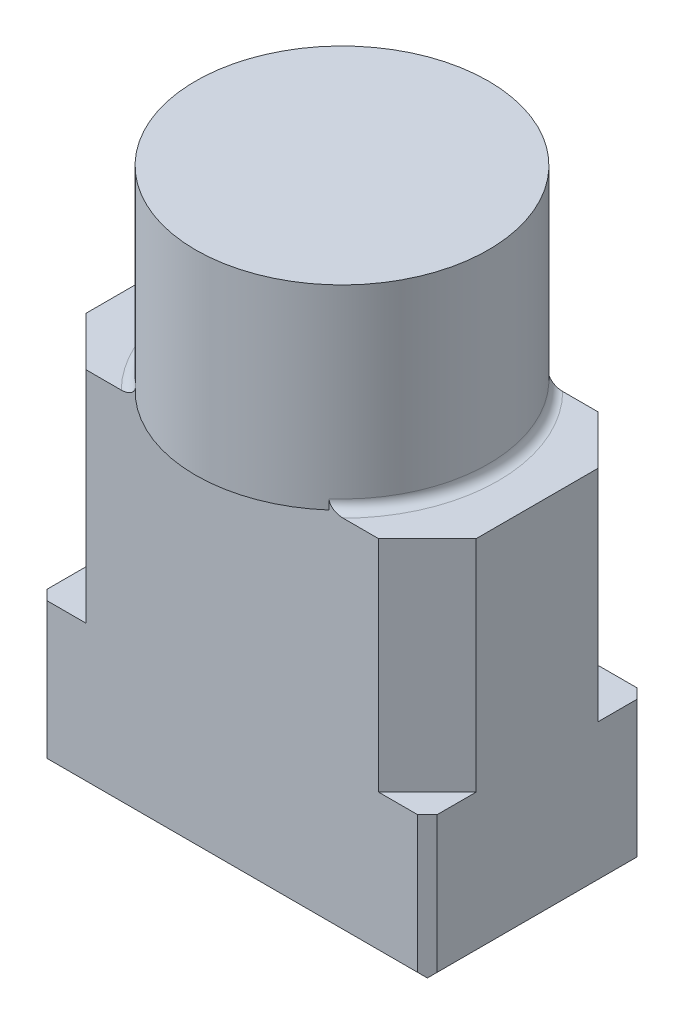
ISO-10303-21;
HEADER;
FILE_DESCRIPTION(('STEP AP214'),'2;1');
FILE_NAME('part.step','',(''),(''),'','','');
FILE_SCHEMA(('AUTOMOTIVE_DESIGN { 1 0 10303 214 1 1 1 1 }'));
ENDSEC;
DATA;
#1=APPLICATION_CONTEXT('core data for automotive mechanical design processes');
#2=APPLICATION_PROTOCOL_DEFINITION('international standard','automotive_design',2000,#1);
#3=PRODUCT_CONTEXT('',#1,'mechanical');
#4=PRODUCT('Part','Part','',(#3));
#5=PRODUCT_RELATED_PRODUCT_CATEGORY('part','',(#4));
#6=PRODUCT_DEFINITION_FORMATION('','',#4);
#7=PRODUCT_DEFINITION_CONTEXT('part definition',#1,'design');
#8=PRODUCT_DEFINITION('design','',#6,#7);
#9=PRODUCT_DEFINITION_SHAPE('','',#8);
#10=(LENGTH_UNIT() NAMED_UNIT(*) SI_UNIT(.MILLI.,.METRE.));
#11=(NAMED_UNIT(*) PLANE_ANGLE_UNIT() SI_UNIT($,.RADIAN.));
#12=(NAMED_UNIT(*) SI_UNIT($,.STERADIAN.) SOLID_ANGLE_UNIT());
#13=UNCERTAINTY_MEASURE_WITH_UNIT(LENGTH_MEASURE(1.E-05),#10,'distance_accuracy_value','');
#14=(GEOMETRIC_REPRESENTATION_CONTEXT(3) GLOBAL_UNCERTAINTY_ASSIGNED_CONTEXT((#13)) GLOBAL_UNIT_ASSIGNED_CONTEXT((#10,
#11,#12)) REPRESENTATION_CONTEXT('',''));
#15=CARTESIAN_POINT('',(0.,0.,0.));
#16=DIRECTION('',(0.,0.,1.));
#17=DIRECTION('',(1.,0.,0.));
#18=AXIS2_PLACEMENT_3D('',#15,#16,#17);
#19=CARTESIAN_POINT('',(0.,0.,0.));
#20=DIRECTION('',(0.,1.,0.));
#21=DIRECTION('',(0.,0.,1.));
#22=AXIS2_PLACEMENT_3D('',#19,#20,#21);
#23=PLANE('',#22);
#24=DIRECTION('',(-1.,0.,0.));
#25=VECTOR('',#24,1.);
#26=CARTESIAN_POINT('',(40.,0.,22.5));
#27=LINE('',#26,#25);
#28=CARTESIAN_POINT('',(19.8431348329844,0.,22.5));
#29=VERTEX_POINT('',#28);
#30=CARTESIAN_POINT('',(-19.8431348329844,0.,22.5));
#31=VERTEX_POINT('',#30);
#32=EDGE_CURVE('E311',#29,#31,#27,.T.);
#33=ORIENTED_EDGE('',*,*,#32,.F.);
#34=CARTESIAN_POINT('',(0.,0.,0.));
#35=DIRECTION('',(0.,1.,0.));
#36=DIRECTION('',(0.,0.,1.));
#37=AXIS2_PLACEMENT_3D('',#34,#35,#36);
#38=CIRCLE('',#37,30.);
#39=EDGE_CURVE('E310',#31,#29,#38,.T.);
#40=ORIENTED_EDGE('',*,*,#39,.F.);
#41=EDGE_LOOP('',(#33,#40));
#42=FACE_BOUND('',#41,.T.);
#43=ADVANCED_FACE('F32',(#42),#23,.F.);
#44=DIRECTION('',(1.,0.,0.));
#45=VECTOR('',#44,1.);
#46=CARTESIAN_POINT('',(40.,0.,-22.5));
#47=LINE('',#46,#45);
#48=CARTESIAN_POINT('',(-19.8431348329844,0.,-22.5));
#49=VERTEX_POINT('',#48);
#50=CARTESIAN_POINT('',(19.8431348329844,0.,-22.5));
#51=VERTEX_POINT('',#50);
#52=EDGE_CURVE('E304',#49,#51,#47,.T.);
#53=ORIENTED_EDGE('',*,*,#52,.F.);
#54=EDGE_CURVE('E315',#51,#49,#38,.T.);
#55=ORIENTED_EDGE('',*,*,#54,.F.);
#56=EDGE_LOOP('',(#53,#55));
#57=FACE_BOUND('',#56,.T.);
#58=ADVANCED_FACE('F481',(#57),#23,.F.);
#59=CARTESIAN_POINT('',(0.,40.,0.));
#60=DIRECTION('',(0.,-1.,0.));
#61=DIRECTION('',(0.,0.,-1.));
#62=AXIS2_PLACEMENT_3D('',#59,#60,#61);
#63=CYLINDRICAL_SURFACE('',#62,30.);
#64=CARTESIAN_POINT('',(0.,40.,0.));
#65=DIRECTION('',(0.,1.,0.));
#66=DIRECTION('',(0.,0.,1.));
#67=AXIS2_PLACEMENT_3D('',#64,#65,#66);
#68=CIRCLE('',#67,30.);
#69=CARTESIAN_POINT('',(0.,40.,30.));
#70=VERTEX_POINT('',#69);
#71=EDGE_CURVE('E312',#70,#70,#68,.T.);
#72=ORIENTED_EDGE('',*,*,#71,.F.);
#73=EDGE_LOOP('',(#72));
#74=FACE_BOUND('',#73,.T.);
#75=CARTESIAN_POINT('',(0.,2.,0.));
#76=DIRECTION('',(0.,1.,0.));
#77=DIRECTION('',(0.,0.,1.));
#78=AXIS2_PLACEMENT_3D('',#75,#76,#77);
#79=CIRCLE('',#78,30.);
#80=CARTESIAN_POINT('',(-19.8431348329844,2.,-22.5));
#81=VERTEX_POINT('',#80);
#82=CARTESIAN_POINT('',(-19.8431348329844,2.,22.5));
#83=VERTEX_POINT('',#82);
#84=EDGE_CURVE('E408',#81,#83,#79,.T.);
#85=ORIENTED_EDGE('',*,*,#84,.T.);
#86=DIRECTION('',(0.,-1.,0.));
#87=VECTOR('',#86,1.);
#88=CARTESIAN_POINT('',(-19.8431348329844,2.,22.5));
#89=LINE('',#88,#87);
#90=EDGE_CURVE('E411',#83,#31,#89,.T.);
#91=ORIENTED_EDGE('',*,*,#90,.T.);
#92=ORIENTED_EDGE('',*,*,#39,.T.);
#93=DIRECTION('',(0.,-1.,0.));
#94=VECTOR('',#93,1.);
#95=CARTESIAN_POINT('',(19.8431348329844,0.,22.5));
#96=LINE('',#95,#94);
#97=CARTESIAN_POINT('',(19.8431348329844,2.,22.5));
#98=VERTEX_POINT('',#97);
#99=EDGE_CURVE('E51',#29,#98,#96,.F.);
#100=ORIENTED_EDGE('',*,*,#99,.T.);
#101=CARTESIAN_POINT('',(0.,2.,0.));
#102=DIRECTION('',(0.,1.,0.));
#103=DIRECTION('',(0.,0.,1.));
#104=AXIS2_PLACEMENT_3D('',#101,#102,#103);
#105=CIRCLE('',#104,30.);
#106=CARTESIAN_POINT('',(19.8431348329844,2.,-22.5));
#107=VERTEX_POINT('',#106);
#108=EDGE_CURVE('E401',#98,#107,#105,.T.);
#109=ORIENTED_EDGE('',*,*,#108,.T.);
#110=DIRECTION('',(0.,-1.,0.));
#111=VECTOR('',#110,1.);
#112=CARTESIAN_POINT('',(19.8431348329844,2.,-22.5));
#113=LINE('',#112,#111);
#114=EDGE_CURVE('E405',#107,#51,#113,.T.);
#115=ORIENTED_EDGE('',*,*,#114,.T.);
#116=ORIENTED_EDGE('',*,*,#54,.T.);
#117=DIRECTION('',(0.,-1.,0.));
#118=VECTOR('',#117,1.);
#119=CARTESIAN_POINT('',(-19.8431348329844,0.,-22.5));
#120=LINE('',#119,#118);
#121=EDGE_CURVE('E59',#49,#81,#120,.F.);
#122=ORIENTED_EDGE('',*,*,#121,.T.);
#123=EDGE_LOOP('',(#85,#91,#92,#100,#109,#115,#116,#122));
#124=FACE_BOUND('',#123,.T.);
#125=ADVANCED_FACE('F477',(#74,#124),#63,.T.);
#126=CARTESIAN_POINT('',(0.,40.,0.));
#127=DIRECTION('',(0.,1.,0.));
#128=DIRECTION('',(0.,0.,1.));
#129=AXIS2_PLACEMENT_3D('',#126,#127,#128);
#130=PLANE('',#129);
#131=ORIENTED_EDGE('',*,*,#71,.T.);
#132=EDGE_LOOP('',(#131));
#133=FACE_BOUND('',#132,.T.);
#134=ADVANCED_FACE('F480',(#133),#130,.T.);
#135=CARTESIAN_POINT('',(0.,0.,0.));
#136=DIRECTION('',(0.,1.,0.));
#137=DIRECTION('',(0.,0.,1.));
#138=AXIS2_PLACEMENT_3D('',#135,#136,#137);
#139=PLANE('',#138);
#140=CARTESIAN_POINT('',(22.7541205059655,0.,-22.5));
#141=VERTEX_POINT('',#140);
#142=CARTESIAN_POINT('',(30.,0.,-22.5));
#143=VERTEX_POINT('',#142);
#144=EDGE_CURVE('E299',#141,#143,#47,.T.);
#145=ORIENTED_EDGE('',*,*,#144,.F.);
#146=CARTESIAN_POINT('',(0.,0.,0.));
#147=DIRECTION('',(0.,1.,0.));
#148=DIRECTION('',(0.,0.,1.));
#149=AXIS2_PLACEMENT_3D('',#146,#147,#148);
#150=CIRCLE('',#149,32.);
#151=CARTESIAN_POINT('',(22.7541205059655,0.,22.5));
#152=VERTEX_POINT('',#151);
#153=EDGE_CURVE('E415',#141,#152,#150,.F.);
#154=ORIENTED_EDGE('',*,*,#153,.T.);
#155=CARTESIAN_POINT('',(30.,0.,22.5));
#156=VERTEX_POINT('',#155);
#157=EDGE_CURVE('E308',#156,#152,#27,.T.);
#158=ORIENTED_EDGE('',*,*,#157,.F.);
#159=DIRECTION('',(-0.707106781186546,0.,0.707106781186549));
#160=VECTOR('',#159,1.);
#161=CARTESIAN_POINT('',(26.2500000000001,0.,26.25));
#162=LINE('',#161,#160);
#163=CARTESIAN_POINT('',(40.,0.,12.5));
#164=VERTEX_POINT('',#163);
#165=EDGE_CURVE('E232',#156,#164,#162,.F.);
#166=ORIENTED_EDGE('',*,*,#165,.T.);
#167=DIRECTION('',(0.,0.,1.));
#168=VECTOR('',#167,1.);
#169=CARTESIAN_POINT('',(40.,0.,22.5));
#170=LINE('',#169,#168);
#171=CARTESIAN_POINT('',(40.,0.,-12.5));
#172=VERTEX_POINT('',#171);
#173=EDGE_CURVE('E303',#172,#164,#170,.T.);
#174=ORIENTED_EDGE('',*,*,#173,.F.);
#175=DIRECTION('',(0.707106781186549,0.,0.707106781186546));
#176=VECTOR('',#175,1.);
#177=CARTESIAN_POINT('',(26.2499999999999,0.,-26.25));
#178=LINE('',#177,#176);
#179=EDGE_CURVE('E243',#172,#143,#178,.F.);
#180=ORIENTED_EDGE('',*,*,#179,.T.);
#181=EDGE_LOOP('',(#145,#154,#158,#166,#174,#180));
#182=FACE_BOUND('',#181,.T.);
#183=ADVANCED_FACE('F488',(#182),#139,.T.);
#184=CARTESIAN_POINT('',(-22.7541205059655,0.,22.5));
#185=VERTEX_POINT('',#184);
#186=CARTESIAN_POINT('',(-30.,0.,22.5));
#187=VERTEX_POINT('',#186);
#188=EDGE_CURVE('E307',#185,#187,#27,.T.);
#189=ORIENTED_EDGE('',*,*,#188,.F.);
#190=CARTESIAN_POINT('',(0.,0.,0.));
#191=DIRECTION('',(0.,1.,0.));
#192=DIRECTION('',(0.,0.,1.));
#193=AXIS2_PLACEMENT_3D('',#190,#191,#192);
#194=CIRCLE('',#193,32.);
#195=CARTESIAN_POINT('',(-22.7541205059655,0.,-22.5));
#196=VERTEX_POINT('',#195);
#197=EDGE_CURVE('E413',#185,#196,#194,.F.);
#198=ORIENTED_EDGE('',*,*,#197,.T.);
#199=CARTESIAN_POINT('',(-30.,0.,-22.5));
#200=VERTEX_POINT('',#199);
#201=EDGE_CURVE('E300',#200,#196,#47,.T.);
#202=ORIENTED_EDGE('',*,*,#201,.F.);
#203=DIRECTION('',(0.707106781186547,0.,-0.707106781186549));
#204=VECTOR('',#203,1.);
#205=CARTESIAN_POINT('',(-26.25,0.,-26.25));
#206=LINE('',#205,#204);
#207=CARTESIAN_POINT('',(-40.,0.,-12.5));
#208=VERTEX_POINT('',#207);
#209=EDGE_CURVE('E269',#200,#208,#206,.F.);
#210=ORIENTED_EDGE('',*,*,#209,.T.);
#211=DIRECTION('',(0.,0.,-1.));
#212=VECTOR('',#211,1.);
#213=CARTESIAN_POINT('',(-40.,0.,22.5));
#214=LINE('',#213,#212);
#215=CARTESIAN_POINT('',(-40.,0.,12.5));
#216=VERTEX_POINT('',#215);
#217=EDGE_CURVE('E223',#216,#208,#214,.T.);
#218=ORIENTED_EDGE('',*,*,#217,.F.);
#219=DIRECTION('',(-0.70710678118655,0.,-0.707106781186546));
#220=VECTOR('',#219,1.);
#221=CARTESIAN_POINT('',(-26.2499999999999,0.,26.25));
#222=LINE('',#221,#220);
#223=EDGE_CURVE('E234',#216,#187,#222,.F.);
#224=ORIENTED_EDGE('',*,*,#223,.T.);
#225=EDGE_LOOP('',(#189,#198,#202,#210,#218,#224));
#226=FACE_BOUND('',#225,.T.);
#227=ADVANCED_FACE('F351',(#226),#139,.T.);
#228=CARTESIAN_POINT('',(-40.,-45.,22.5));
#229=DIRECTION('',(1.,0.,0.));
#230=DIRECTION('',(0.,0.,-1.));
#231=AXIS2_PLACEMENT_3D('',#228,#229,#230);
#232=PLANE('',#231);
#233=DIRECTION('',(0.,-1.,0.));
#234=VECTOR('',#233,1.);
#235=CARTESIAN_POINT('',(-40.,-45.,-20.5));
#236=LINE('',#235,#234);
#237=CARTESIAN_POINT('',(-40.,-45.,-20.5));
#238=VERTEX_POINT('',#237);
#239=CARTESIAN_POINT('',(-40.,-73.,-20.5));
#240=VERTEX_POINT('',#239);
#241=EDGE_CURVE('E378',#238,#240,#236,.T.);
#242=ORIENTED_EDGE('',*,*,#241,.T.);
#243=DIRECTION('',(0.,0.,1.));
#244=VECTOR('',#243,1.);
#245=CARTESIAN_POINT('',(-40.,-73.,22.5));
#246=LINE('',#245,#244);
#247=CARTESIAN_POINT('',(-40.,-73.,20.5));
#248=VERTEX_POINT('',#247);
#249=EDGE_CURVE('E763',#240,#248,#246,.T.);
#250=ORIENTED_EDGE('',*,*,#249,.T.);
#251=DIRECTION('',(0.,1.,0.));
#252=VECTOR('',#251,1.);
#253=CARTESIAN_POINT('',(-40.,-45.,20.5));
#254=LINE('',#253,#252);
#255=CARTESIAN_POINT('',(-40.,-45.,20.5));
#256=VERTEX_POINT('',#255);
#257=EDGE_CURVE('E786',#248,#256,#254,.T.);
#258=ORIENTED_EDGE('',*,*,#257,.T.);
#259=DIRECTION('',(0.,0.,-1.));
#260=VECTOR('',#259,1.);
#261=CARTESIAN_POINT('',(-40.,-45.,22.5));
#262=LINE('',#261,#260);
#263=CARTESIAN_POINT('',(-40.,-45.,12.5));
#264=VERTEX_POINT('',#263);
#265=EDGE_CURVE('E296',#256,#264,#262,.T.);
#266=ORIENTED_EDGE('',*,*,#265,.T.);
#267=DIRECTION('',(0.,1.,0.));
#268=VECTOR('',#267,1.);
#269=CARTESIAN_POINT('',(-40.,-45.,12.5));
#270=LINE('',#269,#268);
#271=EDGE_CURVE('E266',#264,#216,#270,.T.);
#272=ORIENTED_EDGE('',*,*,#271,.T.);
#273=ORIENTED_EDGE('',*,*,#217,.T.);
#274=DIRECTION('',(0.,-1.,0.));
#275=VECTOR('',#274,1.);
#276=CARTESIAN_POINT('',(-40.,-45.,-12.5));
#277=LINE('',#276,#275);
#278=CARTESIAN_POINT('',(-40.,-45.,-12.5));
#279=VERTEX_POINT('',#278);
#280=EDGE_CURVE('E270',#208,#279,#277,.T.);
#281=ORIENTED_EDGE('',*,*,#280,.T.);
#282=EDGE_CURVE('E380',#279,#238,#262,.T.);
#283=ORIENTED_EDGE('',*,*,#282,.T.);
#284=EDGE_LOOP('',(#242,#250,#258,#266,#272,#273,#281,#283));
#285=FACE_BOUND('',#284,.T.);
#286=ADVANCED_FACE('F490',(#285),#232,.F.);
#287=CARTESIAN_POINT('',(40.,-45.,-22.5));
#288=DIRECTION('',(0.,0.,1.));
#289=DIRECTION('',(1.,0.,0.));
#290=AXIS2_PLACEMENT_3D('',#287,#288,#289);
#291=PLANE('',#290);
#292=DIRECTION('',(0.,-1.,0.));
#293=VECTOR('',#292,1.);
#294=CARTESIAN_POINT('',(38.,-45.,-22.5));
#295=LINE('',#294,#293);
#296=CARTESIAN_POINT('',(38.,-45.,-22.5));
#297=VERTEX_POINT('',#296);
#298=CARTESIAN_POINT('',(38.,-73.,-22.5));
#299=VERTEX_POINT('',#298);
#300=EDGE_CURVE('E369',#297,#299,#295,.T.);
#301=ORIENTED_EDGE('',*,*,#300,.T.);
#302=DIRECTION('',(-1.,0.,0.));
#303=VECTOR('',#302,1.);
#304=CARTESIAN_POINT('',(40.,-73.,-22.5));
#305=LINE('',#304,#303);
#306=CARTESIAN_POINT('',(-38.,-73.,-22.5));
#307=VERTEX_POINT('',#306);
#308=EDGE_CURVE('E402',#299,#307,#305,.T.);
#309=ORIENTED_EDGE('',*,*,#308,.T.);
#310=DIRECTION('',(0.,1.,0.));
#311=VECTOR('',#310,1.);
#312=CARTESIAN_POINT('',(-38.,-45.,-22.5));
#313=LINE('',#312,#311);
#314=CARTESIAN_POINT('',(-38.,-45.,-22.5));
#315=VERTEX_POINT('',#314);
#316=EDGE_CURVE('E374',#307,#315,#313,.T.);
#317=ORIENTED_EDGE('',*,*,#316,.T.);
#318=DIRECTION('',(1.,0.,0.));
#319=VECTOR('',#318,1.);
#320=CARTESIAN_POINT('',(40.,-45.,-22.5));
#321=LINE('',#320,#319);
#322=CARTESIAN_POINT('',(-30.,-45.,-22.5));
#323=VERTEX_POINT('',#322);
#324=EDGE_CURVE('E292',#315,#323,#321,.T.);
#325=ORIENTED_EDGE('',*,*,#324,.T.);
#326=DIRECTION('',(0.,1.,0.));
#327=VECTOR('',#326,1.);
#328=CARTESIAN_POINT('',(-30.,-45.,-22.5));
#329=LINE('',#328,#327);
#330=EDGE_CURVE('E331',#323,#200,#329,.T.);
#331=ORIENTED_EDGE('',*,*,#330,.T.);
#332=ORIENTED_EDGE('',*,*,#201,.T.);
#333=CARTESIAN_POINT('',(-22.7541205059655,0.,-22.5));
#334=CARTESIAN_POINT('',(-22.6433971007705,2.36761679177834E-05,-22.5));
#335=CARTESIAN_POINT('',(-22.5326766813172,0.00465017165781956,-22.5));
#336=CARTESIAN_POINT('',(-22.3118952944603,0.0230818227472528,-22.5));
#337=CARTESIAN_POINT('',(-22.2018350659178,0.036895824977271,-22.5));
#338=CARTESIAN_POINT('',(-21.9822073019926,0.0738497698862053,-22.5));
#339=CARTESIAN_POINT('',(-21.8726543424645,0.0970769300775826,-22.5));
#340=CARTESIAN_POINT('',(-21.6560514849984,0.152984760131705,-22.5));
#341=CARTESIAN_POINT('',(-21.5490003597682,0.185660684962082,-22.5));
#342=CARTESIAN_POINT('',(-21.2911653683069,0.277572676534012,-22.5));
#343=CARTESIAN_POINT('',(-21.1422353079033,0.342151540164885,-22.5));
#344=CARTESIAN_POINT('',(-20.8561563292135,0.493059153073709,-22.5));
#345=CARTESIAN_POINT('',(-20.7189694369898,0.579313948244062,-22.5));
#346=CARTESIAN_POINT('',(-20.5020673219748,0.745435658673011,-22.5));
#347=CARTESIAN_POINT('',(-20.417639900256,0.819130960484328,-22.5));
#348=CARTESIAN_POINT('',(-20.260875071115,0.978544215802031,-22.5));
#349=CARTESIAN_POINT('',(-20.1885243033336,1.06424868783676,-22.5));
#350=CARTESIAN_POINT('',(-20.0749545277737,1.22686941696232,-22.5));
#351=CARTESIAN_POINT('',(-20.0303929813248,1.30143812339788,-22.5));
#352=CARTESIAN_POINT('',(-19.9540571284439,1.45675546292002,-22.5));
#353=CARTESIAN_POINT('',(-19.9222490862714,1.53748711040311,-22.5));
#354=CARTESIAN_POINT('',(-19.8801166811679,1.6818738328895,-22.5));
#355=CARTESIAN_POINT('',(-19.8663599441455,1.74452717318671,-22.5));
#356=CARTESIAN_POINT('',(-19.8524840251027,1.83961567051895,-22.5));
#357=CARTESIAN_POINT('',(-19.8489850340242,1.87157977883635,-22.5));
#358=CARTESIAN_POINT('',(-19.8443079059745,1.93569258391361,-22.5));
#359=CARTESIAN_POINT('',(-19.8431308933694,1.96784136254322,-22.5));
#360=CARTESIAN_POINT('',(-19.8431348329844,2.,-22.5));
#361=B_SPLINE_CURVE_WITH_KNOTS('',3,(#333,#334,#335,#336,#337,#338,#339,#340,#341,#342,#343,
#344,#345,#346,#347,#348,#349,#350,#351,#352,#353,#354,#355,#356,#357,#358,#359,#360),
.UNSPECIFIED.,.F.,.F.,(4,2,2,2,2,2,2,2,2,2,2,2,2,4),(0.,0.332070755218153,0.664461724476717,
1.00000555949326,1.33538118104082,1.82075073436292,2.30448626429359,2.63968108467511,
2.97450258653422,3.23414563321989,3.49309726430091,3.68488626481759,3.78127515704459,
3.87771071198939),.UNSPECIFIED.);
#362=EDGE_CURVE('E421',#196,#81,#361,.T.);
#363=ORIENTED_EDGE('',*,*,#362,.T.);
#364=ORIENTED_EDGE('',*,*,#121,.F.);
#365=ORIENTED_EDGE('',*,*,#52,.T.);
#366=ORIENTED_EDGE('',*,*,#114,.F.);
#367=CARTESIAN_POINT('',(19.8431348329844,2.,-22.5));
#368=CARTESIAN_POINT('',(19.8431157670582,1.95647778152635,-22.5));
#369=CARTESIAN_POINT('',(19.8452819412367,1.91296644087118,-22.5));
#370=CARTESIAN_POINT('',(19.8538372897338,1.82640455737113,-22.5));
#371=CARTESIAN_POINT('',(19.8602221081121,1.78335358571873,-22.5));
#372=CARTESIAN_POINT('',(19.8769820734628,1.69849427190878,-22.5));
#373=CARTESIAN_POINT('',(19.88731593648,1.65667774119308,-22.5));
#374=CARTESIAN_POINT('',(19.9117218260093,1.57415612291982,-22.5));
#375=CARTESIAN_POINT('',(19.9257945961687,1.53345125824437,-22.5));
#376=CARTESIAN_POINT('',(19.9730612842946,1.41373535449372,-22.5));
#377=CARTESIAN_POINT('',(20.011390155473,1.33670697563342,-22.5));
#378=CARTESIAN_POINT('',(20.0992283627342,1.18921342957941,-22.5));
#379=CARTESIAN_POINT('',(20.1487687726598,1.11876728732178,-22.5));
#380=CARTESIAN_POINT('',(20.2829193482927,0.95230802418444,-22.5));
#381=CARTESIAN_POINT('',(20.3728488275916,0.860584705406214,-22.5));
#382=CARTESIAN_POINT('',(20.5660190980489,0.692448103167228,-22.5));
#383=CARTESIAN_POINT('',(20.6692874847242,0.616067421822249,-22.5));
#384=CARTESIAN_POINT('',(20.8546152700858,0.497171861329595,-22.5));
#385=CARTESIAN_POINT('',(20.9344834345429,0.451170996144392,-22.5));
#386=CARTESIAN_POINT('',(21.0979123660015,0.366237493219417,-22.5));
#387=CARTESIAN_POINT('',(21.1814747665263,0.327308021986423,-22.5));
#388=CARTESIAN_POINT('',(21.43657899507,0.22059798333662,-22.5));
#389=CARTESIAN_POINT('',(21.6124395287213,0.162956653098646,-22.5));
#390=CARTESIAN_POINT('',(21.9491738382032,0.0786565474059895,-22.5));
#391=CARTESIAN_POINT('',(22.109355857138,0.0491369154729093,-22.5));
#392=CARTESIAN_POINT('',(22.3508648364598,0.0196593410239976,-22.5));
#393=CARTESIAN_POINT('',(22.4313359858976,0.0123005890831696,-22.5));
#394=CARTESIAN_POINT('',(22.5925725926038,0.00247414264935571,-22.5));
#395=CARTESIAN_POINT('',(22.6733380366098,6.23041498193151E-06,-22.5));
#396=CARTESIAN_POINT('',(22.7541205059655,0.,-22.5));
#397=B_SPLINE_CURVE_WITH_KNOTS('',3,(#367,#368,#369,#370,#371,#372,#373,#374,#375,#376,#377,
#378,#379,#380,#381,#382,#383,#384,#385,#386,#387,#388,#389,#390,#391,#392,#393,#394,#395,#396),
.UNSPECIFIED.,.F.,.F.,(4,2,2,2,2,2,2,2,2,2,2,2,2,2,4),(0.,0.130495185468386,0.260855838900364,
0.389889397590922,0.518948639556897,0.775809894278517,1.03339197771356,1.41661541823588,
1.80064476435035,2.0767953997999,2.35306938981647,2.90596013268857,3.39337041376922,
3.63565827118668,3.87793534164673),.UNSPECIFIED.);
#398=EDGE_CURVE('E45',#107,#141,#397,.T.);
#399=ORIENTED_EDGE('',*,*,#398,.T.);
#400=ORIENTED_EDGE('',*,*,#144,.T.);
#401=DIRECTION('',(0.,-1.,0.));
#402=VECTOR('',#401,1.);
#403=CARTESIAN_POINT('',(30.,-45.,-22.5));
#404=LINE('',#403,#402);
#405=CARTESIAN_POINT('',(30.,-45.,-22.5));
#406=VERTEX_POINT('',#405);
#407=EDGE_CURVE('E329',#143,#406,#404,.T.);
#408=ORIENTED_EDGE('',*,*,#407,.T.);
#409=EDGE_CURVE('E293',#406,#297,#321,.T.);
#410=ORIENTED_EDGE('',*,*,#409,.T.);
#411=EDGE_LOOP('',(#301,#309,#317,#325,#331,#332,#363,#364,#365,#366,#399,#400,#408,#410));
#412=FACE_BOUND('',#411,.T.);
#413=ADVANCED_FACE('F492',(#412),#291,.F.);
#414=CARTESIAN_POINT('',(40.,-45.,22.5));
#415=DIRECTION('',(-1.,0.,0.));
#416=DIRECTION('',(0.,0.,1.));
#417=AXIS2_PLACEMENT_3D('',#414,#415,#416);
#418=PLANE('',#417);
#419=DIRECTION('',(0.,-1.,0.));
#420=VECTOR('',#419,1.);
#421=CARTESIAN_POINT('',(40.,-45.,20.5));
#422=LINE('',#421,#420);
#423=CARTESIAN_POINT('',(40.,-45.,20.5));
#424=VERTEX_POINT('',#423);
#425=CARTESIAN_POINT('',(40.,-73.,20.5));
#426=VERTEX_POINT('',#425);
#427=EDGE_CURVE('E279',#424,#426,#422,.T.);
#428=ORIENTED_EDGE('',*,*,#427,.T.);
#429=DIRECTION('',(0.,0.,-1.));
#430=VECTOR('',#429,1.);
#431=CARTESIAN_POINT('',(40.,-73.,22.5));
#432=LINE('',#431,#430);
#433=CARTESIAN_POINT('',(40.,-73.,-20.5));
#434=VERTEX_POINT('',#433);
#435=EDGE_CURVE('E765',#426,#434,#432,.T.);
#436=ORIENTED_EDGE('',*,*,#435,.T.);
#437=DIRECTION('',(0.,1.,0.));
#438=VECTOR('',#437,1.);
#439=CARTESIAN_POINT('',(40.,-45.,-20.5));
#440=LINE('',#439,#438);
#441=CARTESIAN_POINT('',(40.,-45.,-20.5));
#442=VERTEX_POINT('',#441);
#443=EDGE_CURVE('E793',#434,#442,#440,.T.);
#444=ORIENTED_EDGE('',*,*,#443,.T.);
#445=DIRECTION('',(0.,0.,1.));
#446=VECTOR('',#445,1.);
#447=CARTESIAN_POINT('',(40.,-45.,22.5));
#448=LINE('',#447,#446);
#449=CARTESIAN_POINT('',(40.,-45.,-12.5));
#450=VERTEX_POINT('',#449);
#451=EDGE_CURVE('E276',#442,#450,#448,.T.);
#452=ORIENTED_EDGE('',*,*,#451,.T.);
#453=DIRECTION('',(0.,1.,0.));
#454=VECTOR('',#453,1.);
#455=CARTESIAN_POINT('',(40.,-45.,-12.5));
#456=LINE('',#455,#454);
#457=EDGE_CURVE('E324',#450,#172,#456,.T.);
#458=ORIENTED_EDGE('',*,*,#457,.T.);
#459=ORIENTED_EDGE('',*,*,#173,.T.);
#460=DIRECTION('',(0.,-1.,0.));
#461=VECTOR('',#460,1.);
#462=CARTESIAN_POINT('',(40.,-45.,12.5));
#463=LINE('',#462,#461);
#464=CARTESIAN_POINT('',(40.,-45.,12.5));
#465=VERTEX_POINT('',#464);
#466=EDGE_CURVE('E252',#164,#465,#463,.T.);
#467=ORIENTED_EDGE('',*,*,#466,.T.);
#468=EDGE_CURVE('E238',#465,#424,#448,.T.);
#469=ORIENTED_EDGE('',*,*,#468,.T.);
#470=EDGE_LOOP('',(#428,#436,#444,#452,#458,#459,#467,#469));
#471=FACE_BOUND('',#470,.T.);
#472=ADVANCED_FACE('F495',(#471),#418,.F.);
#473=CARTESIAN_POINT('',(40.,-45.,22.5));
#474=DIRECTION('',(0.,0.,-1.));
#475=DIRECTION('',(-1.,0.,0.));
#476=AXIS2_PLACEMENT_3D('',#473,#474,#475);
#477=PLANE('',#476);
#478=DIRECTION('',(0.,-1.,0.));
#479=VECTOR('',#478,1.);
#480=CARTESIAN_POINT('',(-38.,-45.,22.5));
#481=LINE('',#480,#479);
#482=CARTESIAN_POINT('',(-38.,-45.,22.5));
#483=VERTEX_POINT('',#482);
#484=CARTESIAN_POINT('',(-38.,-73.,22.5));
#485=VERTEX_POINT('',#484);
#486=EDGE_CURVE('E362',#483,#485,#481,.T.);
#487=ORIENTED_EDGE('',*,*,#486,.T.);
#488=DIRECTION('',(1.,0.,0.));
#489=VECTOR('',#488,1.);
#490=CARTESIAN_POINT('',(40.,-73.,22.5));
#491=LINE('',#490,#489);
#492=CARTESIAN_POINT('',(38.,-73.,22.5));
#493=VERTEX_POINT('',#492);
#494=EDGE_CURVE('E754',#485,#493,#491,.T.);
#495=ORIENTED_EDGE('',*,*,#494,.T.);
#496=DIRECTION('',(0.,1.,0.));
#497=VECTOR('',#496,1.);
#498=CARTESIAN_POINT('',(38.,-45.,22.5));
#499=LINE('',#498,#497);
#500=CARTESIAN_POINT('',(38.,-45.,22.5));
#501=VERTEX_POINT('',#500);
#502=EDGE_CURVE('E219',#493,#501,#499,.T.);
#503=ORIENTED_EDGE('',*,*,#502,.T.);
#504=DIRECTION('',(-1.,0.,0.));
#505=VECTOR('',#504,1.);
#506=CARTESIAN_POINT('',(40.,-45.,22.5));
#507=LINE('',#506,#505);
#508=CARTESIAN_POINT('',(30.,-45.,22.5));
#509=VERTEX_POINT('',#508);
#510=EDGE_CURVE('E210',#501,#509,#507,.T.);
#511=ORIENTED_EDGE('',*,*,#510,.T.);
#512=DIRECTION('',(0.,1.,0.));
#513=VECTOR('',#512,1.);
#514=CARTESIAN_POINT('',(30.,-45.,22.5));
#515=LINE('',#514,#513);
#516=EDGE_CURVE('E215',#509,#156,#515,.T.);
#517=ORIENTED_EDGE('',*,*,#516,.T.);
#518=ORIENTED_EDGE('',*,*,#157,.T.);
#519=CARTESIAN_POINT('',(22.7541205059655,0.,22.5));
#520=CARTESIAN_POINT('',(22.6433971007705,2.36761679174515E-05,22.5));
#521=CARTESIAN_POINT('',(22.5326766813172,0.00465017165781925,22.5));
#522=CARTESIAN_POINT('',(22.3118952944603,0.0230818227472526,22.5));
#523=CARTESIAN_POINT('',(22.2018350659178,0.036895824977271,22.5));
#524=CARTESIAN_POINT('',(21.9822073019926,0.0738497698862051,22.5));
#525=CARTESIAN_POINT('',(21.8726543424645,0.0970769300775822,22.5));
#526=CARTESIAN_POINT('',(21.6560514849984,0.152984760131704,22.5));
#527=CARTESIAN_POINT('',(21.5490003597682,0.18566068496208,22.5));
#528=CARTESIAN_POINT('',(21.2911653683069,0.27757267653401,22.5));
#529=CARTESIAN_POINT('',(21.1422353079033,0.342151540164884,22.5));
#530=CARTESIAN_POINT('',(20.8561563292135,0.493059153073708,22.5));
#531=CARTESIAN_POINT('',(20.7189694369898,0.57931394824406,22.5));
#532=CARTESIAN_POINT('',(20.5020673219748,0.745435658673011,22.5));
#533=CARTESIAN_POINT('',(20.417639900256,0.819130960484327,22.5));
#534=CARTESIAN_POINT('',(20.260875071115,0.97854421580203,22.5));
#535=CARTESIAN_POINT('',(20.1885243033336,1.06424868783676,22.5));
#536=CARTESIAN_POINT('',(20.0749545277737,1.22686941696232,22.5));
#537=CARTESIAN_POINT('',(20.0303929813248,1.30143812339787,22.5));
#538=CARTESIAN_POINT('',(19.9540571284439,1.45675546292002,22.5));
#539=CARTESIAN_POINT('',(19.9222490862714,1.53748711040311,22.5));
#540=CARTESIAN_POINT('',(19.8801166811679,1.68187383288951,22.5));
#541=CARTESIAN_POINT('',(19.8663599441455,1.74452717318671,22.5));
#542=CARTESIAN_POINT('',(19.8524840251027,1.83961567051895,22.5));
#543=CARTESIAN_POINT('',(19.8489850340242,1.87157977883635,22.5));
#544=CARTESIAN_POINT('',(19.8443079059745,1.93569258391361,22.5));
#545=CARTESIAN_POINT('',(19.8431308933694,1.96784136254322,22.5));
#546=CARTESIAN_POINT('',(19.8431348329844,2.,22.5));
#547=B_SPLINE_CURVE_WITH_KNOTS('',3,(#519,#520,#521,#522,#523,#524,#525,#526,#527,#528,#529,
#530,#531,#532,#533,#534,#535,#536,#537,#538,#539,#540,#541,#542,#543,#544,#545,#546),
.UNSPECIFIED.,.F.,.F.,(4,2,2,2,2,2,2,2,2,2,2,2,2,4),(0.,0.332070755218153,0.664461724476717,
1.00000555949326,1.33538118104082,1.82075073436292,2.30448626429359,2.63968108467511,
2.97450258653422,3.23414563321989,3.49309726430091,3.68488626481759,3.7812751570446,
3.87771071198939),.UNSPECIFIED.);
#548=EDGE_CURVE('E11',#152,#98,#547,.T.);
#549=ORIENTED_EDGE('',*,*,#548,.T.);
#550=ORIENTED_EDGE('',*,*,#99,.F.);
#551=ORIENTED_EDGE('',*,*,#32,.T.);
#552=ORIENTED_EDGE('',*,*,#90,.F.);
#553=CARTESIAN_POINT('',(-19.8431348329844,2.,22.5));
#554=CARTESIAN_POINT('',(-19.8431157670582,1.95647778152635,22.5));
#555=CARTESIAN_POINT('',(-19.8452819412366,1.91296644087118,22.5));
#556=CARTESIAN_POINT('',(-19.8538372897338,1.82640455737112,22.5));
#557=CARTESIAN_POINT('',(-19.860222108112,1.78335358571873,22.5));
#558=CARTESIAN_POINT('',(-19.8769820734628,1.69849427190878,22.5));
#559=CARTESIAN_POINT('',(-19.88731593648,1.65667774119308,22.5));
#560=CARTESIAN_POINT('',(-19.9117218260093,1.57415612291982,22.5));
#561=CARTESIAN_POINT('',(-19.9257945961687,1.53345125824437,22.5));
#562=CARTESIAN_POINT('',(-19.9730612842946,1.41373535449372,22.5));
#563=CARTESIAN_POINT('',(-20.011390155473,1.33670697563342,22.5));
#564=CARTESIAN_POINT('',(-20.0992283627342,1.18921342957941,22.5));
#565=CARTESIAN_POINT('',(-20.1487687726598,1.11876728732178,22.5));
#566=CARTESIAN_POINT('',(-20.2829193482927,0.952308024184444,22.5));
#567=CARTESIAN_POINT('',(-20.3728488275916,0.860584705406217,22.5));
#568=CARTESIAN_POINT('',(-20.5660190980489,0.692448103167228,22.5));
#569=CARTESIAN_POINT('',(-20.6692874847242,0.616067421822248,22.5));
#570=CARTESIAN_POINT('',(-20.8546152700858,0.497171861329595,22.5));
#571=CARTESIAN_POINT('',(-20.9344834345429,0.451170996144392,22.5));
#572=CARTESIAN_POINT('',(-21.0979123660015,0.366237493219417,22.5));
#573=CARTESIAN_POINT('',(-21.1814747665263,0.327308021986422,22.5));
#574=CARTESIAN_POINT('',(-21.43657899507,0.220597983336617,22.5));
#575=CARTESIAN_POINT('',(-21.6124395287213,0.162956653098643,22.5));
#576=CARTESIAN_POINT('',(-21.9491738382032,0.0786565474059879,22.5));
#577=CARTESIAN_POINT('',(-22.1093558571381,0.0491369154729082,22.5));
#578=CARTESIAN_POINT('',(-22.3508648364598,0.0196593410239966,22.5));
#579=CARTESIAN_POINT('',(-22.4313359858976,0.0123005890831684,22.5));
#580=CARTESIAN_POINT('',(-22.5925725926038,0.00247414264935471,22.5));
#581=CARTESIAN_POINT('',(-22.6733380366098,6.23041498122525E-06,22.5));
#582=CARTESIAN_POINT('',(-22.7541205059655,0.,22.5));
#583=B_SPLINE_CURVE_WITH_KNOTS('',3,(#553,#554,#555,#556,#557,#558,#559,#560,#561,#562,#563,
#564,#565,#566,#567,#568,#569,#570,#571,#572,#573,#574,#575,#576,#577,#578,#579,#580,#581,#582),
.UNSPECIFIED.,.F.,.F.,(4,2,2,2,2,2,2,2,2,2,2,2,2,2,4),(0.,0.130495185468387,0.260855838900366,
0.389889397590921,0.518948639556897,0.775809894278518,1.03339197771357,1.41661541823588,
1.80064476435035,2.07679539979991,2.35306938981647,2.90596013268858,3.39337041376923,
3.63565827118669,3.87793534164673),.UNSPECIFIED.);
#584=EDGE_CURVE('E347',#83,#185,#583,.T.);
#585=ORIENTED_EDGE('',*,*,#584,.T.);
#586=ORIENTED_EDGE('',*,*,#188,.T.);
#587=DIRECTION('',(0.,-1.,0.));
#588=VECTOR('',#587,1.);
#589=CARTESIAN_POINT('',(-30.,-45.,22.5));
#590=LINE('',#589,#588);
#591=CARTESIAN_POINT('',(-30.,-45.,22.5));
#592=VERTEX_POINT('',#591);
#593=EDGE_CURVE('E233',#187,#592,#590,.T.);
#594=ORIENTED_EDGE('',*,*,#593,.T.);
#595=EDGE_CURVE('E224',#592,#483,#507,.T.);
#596=ORIENTED_EDGE('',*,*,#595,.T.);
#597=EDGE_LOOP('',(#487,#495,#503,#511,#517,#518,#549,#550,#551,#552,#585,#586,#594,#596));
#598=FACE_BOUND('',#597,.T.);
#599=ADVANCED_FACE('F213',(#598),#477,.F.);
#600=CARTESIAN_POINT('',(-40.,-45.,12.5));
#601=DIRECTION('',(0.707106781186545,0.,-0.707106781186549));
#602=DIRECTION('',(0.,1.,0.));
#603=AXIS2_PLACEMENT_3D('',#600,#601,#602);
#604=PLANE('',#603);
#605=DIRECTION('',(0.70710678118655,0.,0.707106781186546));
#606=VECTOR('',#605,1.);
#607=CARTESIAN_POINT('',(-40.,-45.,12.5));
#608=LINE('',#607,#606);
#609=EDGE_CURVE('E239',#592,#264,#608,.F.);
#610=ORIENTED_EDGE('',*,*,#609,.F.);
#611=ORIENTED_EDGE('',*,*,#593,.F.);
#612=ORIENTED_EDGE('',*,*,#223,.F.);
#613=ORIENTED_EDGE('',*,*,#271,.F.);
#614=EDGE_LOOP('',(#610,#611,#612,#613));
#615=FACE_BOUND('',#614,.T.);
#616=ADVANCED_FACE('F354',(#615),#604,.F.);
#617=CARTESIAN_POINT('',(30.,-45.,22.5));
#618=DIRECTION('',(-0.707106781186549,0.,-0.707106781186547));
#619=DIRECTION('',(0.,1.,0.));
#620=AXIS2_PLACEMENT_3D('',#617,#618,#619);
#621=PLANE('',#620);
#622=DIRECTION('',(0.707106781186546,0.,-0.707106781186549));
#623=VECTOR('',#622,1.);
#624=CARTESIAN_POINT('',(30.,-45.,22.5));
#625=LINE('',#624,#623);
#626=EDGE_CURVE('E230',#465,#509,#625,.F.);
#627=ORIENTED_EDGE('',*,*,#626,.F.);
#628=ORIENTED_EDGE('',*,*,#466,.F.);
#629=ORIENTED_EDGE('',*,*,#165,.F.);
#630=ORIENTED_EDGE('',*,*,#516,.F.);
#631=EDGE_LOOP('',(#627,#628,#629,#630));
#632=FACE_BOUND('',#631,.T.);
#633=ADVANCED_FACE('F228',(#632),#621,.F.);
#634=CARTESIAN_POINT('',(-30.,-45.,-22.5));
#635=DIRECTION('',(0.707106781186548,0.,0.707106781186546));
#636=DIRECTION('',(0.,1.,0.));
#637=AXIS2_PLACEMENT_3D('',#634,#635,#636);
#638=PLANE('',#637);
#639=DIRECTION('',(-0.707106781186547,0.,0.707106781186549));
#640=VECTOR('',#639,1.);
#641=CARTESIAN_POINT('',(-30.,-45.,-22.5));
#642=LINE('',#641,#640);
#643=EDGE_CURVE('E240',#279,#323,#642,.F.);
#644=ORIENTED_EDGE('',*,*,#643,.F.);
#645=ORIENTED_EDGE('',*,*,#280,.F.);
#646=ORIENTED_EDGE('',*,*,#209,.F.);
#647=ORIENTED_EDGE('',*,*,#330,.F.);
#648=EDGE_LOOP('',(#644,#645,#646,#647));
#649=FACE_BOUND('',#648,.T.);
#650=ADVANCED_FACE('F468',(#649),#638,.F.);
#651=CARTESIAN_POINT('',(40.,-45.,-12.5));
#652=DIRECTION('',(-0.707106781186546,0.,0.707106781186549));
#653=DIRECTION('',(0.,1.,0.));
#654=AXIS2_PLACEMENT_3D('',#651,#652,#653);
#655=PLANE('',#654);
#656=DIRECTION('',(-0.707106781186549,0.,-0.707106781186546));
#657=VECTOR('',#656,1.);
#658=CARTESIAN_POINT('',(40.,-45.,-12.5));
#659=LINE('',#658,#657);
#660=EDGE_CURVE('E246',#406,#450,#659,.F.);
#661=ORIENTED_EDGE('',*,*,#660,.F.);
#662=ORIENTED_EDGE('',*,*,#407,.F.);
#663=ORIENTED_EDGE('',*,*,#179,.F.);
#664=ORIENTED_EDGE('',*,*,#457,.F.);
#665=EDGE_LOOP('',(#661,#662,#663,#664));
#666=FACE_BOUND('',#665,.T.);
#667=ADVANCED_FACE('F465',(#666),#655,.F.);
#668=CARTESIAN_POINT('',(0.,-45.,0.));
#669=DIRECTION('',(0.,1.,0.));
#670=DIRECTION('',(0.,0.,1.));
#671=AXIS2_PLACEMENT_3D('',#668,#669,#670);
#672=PLANE('',#671);
#673=ORIENTED_EDGE('',*,*,#265,.F.);
#674=DIRECTION('',(-0.707106781186549,0.,-0.707106781186546));
#675=VECTOR('',#674,1.);
#676=CARTESIAN_POINT('',(-30.2499999999999,-45.,30.25));
#677=LINE('',#676,#675);
#678=EDGE_CURVE('E360',#256,#483,#677,.F.);
#679=ORIENTED_EDGE('',*,*,#678,.T.);
#680=ORIENTED_EDGE('',*,*,#595,.F.);
#681=ORIENTED_EDGE('',*,*,#609,.T.);
#682=EDGE_LOOP('',(#673,#679,#680,#681));
#683=FACE_BOUND('',#682,.T.);
#684=ADVANCED_FACE('F358',(#683),#672,.T.);
#685=ORIENTED_EDGE('',*,*,#324,.F.);
#686=DIRECTION('',(0.707106781186546,0.,-0.707106781186549));
#687=VECTOR('',#686,1.);
#688=CARTESIAN_POINT('',(-30.2500000000001,-45.,-30.25));
#689=LINE('',#688,#687);
#690=EDGE_CURVE('E779',#315,#238,#689,.F.);
#691=ORIENTED_EDGE('',*,*,#690,.T.);
#692=ORIENTED_EDGE('',*,*,#282,.F.);
#693=ORIENTED_EDGE('',*,*,#643,.T.);
#694=EDGE_LOOP('',(#685,#691,#692,#693));
#695=FACE_BOUND('',#694,.T.);
#696=ADVANCED_FACE('F583',(#695),#672,.T.);
#697=ORIENTED_EDGE('',*,*,#451,.F.);
#698=DIRECTION('',(0.707106781186548,0.,0.707106781186547));
#699=VECTOR('',#698,1.);
#700=CARTESIAN_POINT('',(30.25,-45.,-30.25));
#701=LINE('',#700,#699);
#702=EDGE_CURVE('E781',#442,#297,#701,.F.);
#703=ORIENTED_EDGE('',*,*,#702,.T.);
#704=ORIENTED_EDGE('',*,*,#409,.F.);
#705=ORIENTED_EDGE('',*,*,#660,.T.);
#706=EDGE_LOOP('',(#697,#703,#704,#705));
#707=FACE_BOUND('',#706,.T.);
#708=ADVANCED_FACE('F590',(#707),#672,.T.);
#709=ORIENTED_EDGE('',*,*,#510,.F.);
#710=DIRECTION('',(-0.707106781186548,0.,0.707106781186548));
#711=VECTOR('',#710,1.);
#712=CARTESIAN_POINT('',(30.25,-45.,30.25));
#713=LINE('',#712,#711);
#714=EDGE_CURVE('E371',#501,#424,#713,.F.);
#715=ORIENTED_EDGE('',*,*,#714,.T.);
#716=ORIENTED_EDGE('',*,*,#468,.F.);
#717=ORIENTED_EDGE('',*,*,#626,.T.);
#718=EDGE_LOOP('',(#709,#715,#716,#717));
#719=FACE_BOUND('',#718,.T.);
#720=ADVANCED_FACE('F236',(#719),#672,.T.);
#721=CARTESIAN_POINT('',(0.,-77.,0.));
#722=DIRECTION('',(0.,1.,0.));
#723=DIRECTION('',(0.,0.,1.));
#724=AXIS2_PLACEMENT_3D('',#721,#722,#723);
#725=PLANE('',#724);
#726=DIRECTION('',(0.,0.,1.));
#727=VECTOR('',#726,1.);
#728=CARTESIAN_POINT('',(36.,-77.,0.));
#729=LINE('',#728,#727);
#730=CARTESIAN_POINT('',(36.,-77.,-18.5));
#731=VERTEX_POINT('',#730);
#732=CARTESIAN_POINT('',(36.,-77.,18.5));
#733=VERTEX_POINT('',#732);
#734=EDGE_CURVE('E733',#731,#733,#729,.T.);
#735=ORIENTED_EDGE('',*,*,#734,.T.);
#736=DIRECTION('',(-1.,0.,0.));
#737=VECTOR('',#736,1.);
#738=CARTESIAN_POINT('',(0.,-77.,18.5));
#739=LINE('',#738,#737);
#740=CARTESIAN_POINT('',(-36.,-77.,18.5));
#741=VERTEX_POINT('',#740);
#742=EDGE_CURVE('E736',#733,#741,#739,.T.);
#743=ORIENTED_EDGE('',*,*,#742,.T.);
#744=DIRECTION('',(0.,0.,-1.));
#745=VECTOR('',#744,1.);
#746=CARTESIAN_POINT('',(-36.,-77.,0.));
#747=LINE('',#746,#745);
#748=CARTESIAN_POINT('',(-36.,-77.,-18.5));
#749=VERTEX_POINT('',#748);
#750=EDGE_CURVE('E739',#741,#749,#747,.T.);
#751=ORIENTED_EDGE('',*,*,#750,.T.);
#752=DIRECTION('',(1.,0.,0.));
#753=VECTOR('',#752,1.);
#754=CARTESIAN_POINT('',(0.,-77.,-18.5));
#755=LINE('',#754,#753);
#756=EDGE_CURVE('E738',#749,#731,#755,.T.);
#757=ORIENTED_EDGE('',*,*,#756,.T.);
#758=EDGE_LOOP('',(#735,#743,#751,#757));
#759=FACE_BOUND('',#758,.T.);
#760=ADVANCED_FACE('F463',(#759),#725,.F.);
#761=CARTESIAN_POINT('',(40.,-45.,-20.5));
#762=DIRECTION('',(-0.707106781186547,0.,0.707106781186548));
#763=DIRECTION('',(0.,1.,0.));
#764=AXIS2_PLACEMENT_3D('',#761,#762,#763);
#765=PLANE('',#764);
#766=ORIENTED_EDGE('',*,*,#443,.F.);
#767=DIRECTION('',(-0.577350269189625,-0.577350269189628,-0.577350269189624));
#768=VECTOR('',#767,1.);
#769=CARTESIAN_POINT('',(49.3333333333334,-63.6666666666666,-11.1666666666667));
#770=LINE('',#769,#768);
#771=CARTESIAN_POINT('',(39.,-74.,-21.5));
#772=VERTEX_POINT('',#771);
#773=EDGE_CURVE('E769',#434,#772,#770,.T.);
#774=ORIENTED_EDGE('',*,*,#773,.T.);
#775=DIRECTION('',(-0.577350269189626,0.577350269189627,-0.577350269189625));
#776=VECTOR('',#775,1.);
#777=CARTESIAN_POINT('',(30.,-65.,-30.5));
#778=LINE('',#777,#776);
#779=EDGE_CURVE('E767',#772,#299,#778,.T.);
#780=ORIENTED_EDGE('',*,*,#779,.T.);
#781=ORIENTED_EDGE('',*,*,#300,.F.);
#782=ORIENTED_EDGE('',*,*,#702,.F.);
#783=EDGE_LOOP('',(#766,#774,#780,#781,#782));
#784=FACE_BOUND('',#783,.T.);
#785=ADVANCED_FACE('F459',(#784),#765,.F.);
#786=CARTESIAN_POINT('',(38.,-45.,22.5));
#787=DIRECTION('',(-0.707106781186547,0.,-0.707106781186547));
#788=DIRECTION('',(0.,1.,0.));
#789=AXIS2_PLACEMENT_3D('',#786,#787,#788);
#790=PLANE('',#789);
#791=ORIENTED_EDGE('',*,*,#502,.F.);
#792=DIRECTION('',(0.577350269189625,-0.577350269189628,-0.577350269189625));
#793=VECTOR('',#792,1.);
#794=CARTESIAN_POINT('',(28.6666666666667,-63.6666666666666,31.8333333333334));
#795=LINE('',#794,#793);
#796=CARTESIAN_POINT('',(39.,-74.,21.5));
#797=VERTEX_POINT('',#796);
#798=EDGE_CURVE('E757',#493,#797,#795,.T.);
#799=ORIENTED_EDGE('',*,*,#798,.T.);
#800=DIRECTION('',(0.577350269189625,0.577350269189627,-0.577350269189625));
#801=VECTOR('',#800,1.);
#802=CARTESIAN_POINT('',(48.,-64.9999999999999,12.5));
#803=LINE('',#802,#801);
#804=EDGE_CURVE('E744',#797,#426,#803,.T.);
#805=ORIENTED_EDGE('',*,*,#804,.T.);
#806=ORIENTED_EDGE('',*,*,#427,.F.);
#807=ORIENTED_EDGE('',*,*,#714,.F.);
#808=EDGE_LOOP('',(#791,#799,#805,#806,#807));
#809=FACE_BOUND('',#808,.T.);
#810=ADVANCED_FACE('F456',(#809),#790,.F.);
#811=CARTESIAN_POINT('',(-40.,-45.,20.5));
#812=DIRECTION('',(0.707106781186546,0.,-0.707106781186549));
#813=DIRECTION('',(0.,1.,0.));
#814=AXIS2_PLACEMENT_3D('',#811,#812,#813);
#815=PLANE('',#814);
#816=DIRECTION('',(0.577350269189625,-0.577350269189629,0.577350269189623));
#817=VECTOR('',#816,1.);
#818=CARTESIAN_POINT('',(-49.3333333333334,-63.6666666666666,11.1666666666667));
#819=LINE('',#818,#817);
#820=CARTESIAN_POINT('',(-39.,-74.,21.5));
#821=VERTEX_POINT('',#820);
#822=EDGE_CURVE('E748',#248,#821,#819,.T.);
#823=ORIENTED_EDGE('',*,*,#822,.T.);
#824=DIRECTION('',(0.577350269189626,0.577350269189627,0.577350269189624));
#825=VECTOR('',#824,1.);
#826=CARTESIAN_POINT('',(-30.,-64.9999999999999,30.5));
#827=LINE('',#826,#825);
#828=EDGE_CURVE('E368',#821,#485,#827,.T.);
#829=ORIENTED_EDGE('',*,*,#828,.T.);
#830=ORIENTED_EDGE('',*,*,#486,.F.);
#831=ORIENTED_EDGE('',*,*,#678,.F.);
#832=ORIENTED_EDGE('',*,*,#257,.F.);
#833=EDGE_LOOP('',(#823,#829,#830,#831,#832));
#834=FACE_BOUND('',#833,.T.);
#835=ADVANCED_FACE('F365',(#834),#815,.F.);
#836=CARTESIAN_POINT('',(-38.,-45.,-22.5));
#837=DIRECTION('',(0.707106781186549,0.,0.707106781186546));
#838=DIRECTION('',(0.,1.,0.));
#839=AXIS2_PLACEMENT_3D('',#836,#837,#838);
#840=PLANE('',#839);
#841=DIRECTION('',(-0.577350269189624,-0.577350269189628,0.577350269189626));
#842=VECTOR('',#841,1.);
#843=CARTESIAN_POINT('',(-28.6666666666667,-63.6666666666666,-31.8333333333334));
#844=LINE('',#843,#842);
#845=CARTESIAN_POINT('',(-39.,-74.,-21.5));
#846=VERTEX_POINT('',#845);
#847=EDGE_CURVE('E759',#307,#846,#844,.T.);
#848=ORIENTED_EDGE('',*,*,#847,.T.);
#849=DIRECTION('',(-0.577350269189624,0.577350269189627,0.577350269189626));
#850=VECTOR('',#849,1.);
#851=CARTESIAN_POINT('',(-48.,-64.9999999999999,-12.5));
#852=LINE('',#851,#850);
#853=EDGE_CURVE('E761',#846,#240,#852,.T.);
#854=ORIENTED_EDGE('',*,*,#853,.T.);
#855=ORIENTED_EDGE('',*,*,#241,.F.);
#856=ORIENTED_EDGE('',*,*,#690,.F.);
#857=ORIENTED_EDGE('',*,*,#316,.F.);
#858=EDGE_LOOP('',(#848,#854,#855,#856,#857));
#859=FACE_BOUND('',#858,.T.);
#860=ADVANCED_FACE('F440',(#859),#840,.F.);
#861=CARTESIAN_POINT('',(0.,-77.,-18.5));
#862=DIRECTION('',(0.,0.707106781186546,0.707106781186549));
#863=DIRECTION('',(1.,0.,0.));
#864=AXIS2_PLACEMENT_3D('',#861,#862,#863);
#865=PLANE('',#864);
#866=ORIENTED_EDGE('',*,*,#308,.F.);
#867=ORIENTED_EDGE('',*,*,#779,.F.);
#868=DIRECTION('',(0.577350269189625,0.577350269189627,-0.577350269189625));
#869=VECTOR('',#868,1.);
#870=CARTESIAN_POINT('',(29.8333333333334,-83.1666666666667,-12.3333333333334));
#871=LINE('',#870,#869);
#872=EDGE_CURVE('E384',#731,#772,#871,.T.);
#873=ORIENTED_EDGE('',*,*,#872,.F.);
#874=ORIENTED_EDGE('',*,*,#756,.F.);
#875=DIRECTION('',(-0.577350269189624,0.577350269189628,-0.577350269189625));
#876=VECTOR('',#875,1.);
#877=CARTESIAN_POINT('',(-24.0000000000001,-89.,-6.50000000000007));
#878=LINE('',#877,#876);
#879=EDGE_CURVE('E389',#846,#749,#878,.F.);
#880=ORIENTED_EDGE('',*,*,#879,.F.);
#881=ORIENTED_EDGE('',*,*,#847,.F.);
#882=EDGE_LOOP('',(#866,#867,#873,#874,#880,#881));
#883=FACE_BOUND('',#882,.T.);
#884=ADVANCED_FACE('F435',(#883),#865,.F.);
#885=CARTESIAN_POINT('',(36.,-77.,0.));
#886=DIRECTION('',(-0.707106781186549,0.707106781186546,0.));
#887=DIRECTION('',(0.,0.,1.));
#888=AXIS2_PLACEMENT_3D('',#885,#886,#887);
#889=PLANE('',#888);
#890=ORIENTED_EDGE('',*,*,#435,.F.);
#891=ORIENTED_EDGE('',*,*,#804,.F.);
#892=DIRECTION('',(0.577350269189625,0.577350269189627,0.577350269189625));
#893=VECTOR('',#892,1.);
#894=CARTESIAN_POINT('',(24.,-89.,6.50000000000005));
#895=LINE('',#894,#893);
#896=EDGE_CURVE('E396',#733,#797,#895,.T.);
#897=ORIENTED_EDGE('',*,*,#896,.F.);
#898=ORIENTED_EDGE('',*,*,#734,.F.);
#899=ORIENTED_EDGE('',*,*,#872,.T.);
#900=ORIENTED_EDGE('',*,*,#773,.F.);
#901=EDGE_LOOP('',(#890,#891,#897,#898,#899,#900));
#902=FACE_BOUND('',#901,.T.);
#903=ADVANCED_FACE('F439',(#902),#889,.F.);
#904=CARTESIAN_POINT('',(-36.,-77.,0.));
#905=DIRECTION('',(0.70710678118655,0.707106781186545,0.));
#906=DIRECTION('',(0.,0.,-1.));
#907=AXIS2_PLACEMENT_3D('',#904,#905,#906);
#908=PLANE('',#907);
#909=ORIENTED_EDGE('',*,*,#879,.T.);
#910=ORIENTED_EDGE('',*,*,#750,.F.);
#911=DIRECTION('',(-0.577350269189625,0.577350269189628,0.577350269189625));
#912=VECTOR('',#911,1.);
#913=CARTESIAN_POINT('',(-29.8333333333334,-83.1666666666667,12.3333333333334));
#914=LINE('',#913,#912);
#915=EDGE_CURVE('E745',#821,#741,#914,.F.);
#916=ORIENTED_EDGE('',*,*,#915,.F.);
#917=ORIENTED_EDGE('',*,*,#822,.F.);
#918=ORIENTED_EDGE('',*,*,#249,.F.);
#919=ORIENTED_EDGE('',*,*,#853,.F.);
#920=EDGE_LOOP('',(#909,#910,#916,#917,#918,#919));
#921=FACE_BOUND('',#920,.T.);
#922=ADVANCED_FACE('F444',(#921),#908,.F.);
#923=CARTESIAN_POINT('',(0.,-77.,18.5));
#924=DIRECTION('',(0.,0.707106781186546,-0.707106781186549));
#925=DIRECTION('',(-1.,0.,0.));
#926=AXIS2_PLACEMENT_3D('',#923,#924,#925);
#927=PLANE('',#926);
#928=ORIENTED_EDGE('',*,*,#798,.F.);
#929=ORIENTED_EDGE('',*,*,#494,.F.);
#930=ORIENTED_EDGE('',*,*,#828,.F.);
#931=ORIENTED_EDGE('',*,*,#915,.T.);
#932=ORIENTED_EDGE('',*,*,#742,.F.);
#933=ORIENTED_EDGE('',*,*,#896,.T.);
#934=EDGE_LOOP('',(#928,#929,#930,#931,#932,#933));
#935=FACE_BOUND('',#934,.T.);
#936=ADVANCED_FACE('F433',(#935),#927,.F.);
#937=CARTESIAN_POINT('',(0.,2.,0.));
#938=DIRECTION('',(0.,1.,0.));
#939=DIRECTION('',(0.,0.,1.));
#940=AXIS2_PLACEMENT_3D('',#937,#938,#939);
#941=TOROIDAL_SURFACE('',#940,32.,2.);
#942=ORIENTED_EDGE('',*,*,#362,.F.);
#943=ORIENTED_EDGE('',*,*,#197,.F.);
#944=ORIENTED_EDGE('',*,*,#584,.F.);
#945=ORIENTED_EDGE('',*,*,#84,.F.);
#946=EDGE_LOOP('',(#942,#943,#944,#945));
#947=FACE_BOUND('',#946,.T.);
#948=ADVANCED_FACE('F429',(#947),#941,.F.);
#949=CARTESIAN_POINT('',(0.,2.,0.));
#950=DIRECTION('',(0.,1.,0.));
#951=DIRECTION('',(0.,0.,1.));
#952=AXIS2_PLACEMENT_3D('',#949,#950,#951);
#953=TOROIDAL_SURFACE('',#952,32.,2.);
#954=ORIENTED_EDGE('',*,*,#548,.F.);
#955=ORIENTED_EDGE('',*,*,#153,.F.);
#956=ORIENTED_EDGE('',*,*,#398,.F.);
#957=ORIENTED_EDGE('',*,*,#108,.F.);
#958=EDGE_LOOP('',(#954,#955,#956,#957));
#959=FACE_BOUND('',#958,.T.);
#960=ADVANCED_FACE('F34',(#959),#953,.F.);
#961=CLOSED_SHELL('',(#43,#58,#125,#134,#183,#227,#286,#413,#472,#599,#616,#633,#650,#667,#684,
#696,#708,#720,#760,#785,#810,#835,#860,#884,#903,#922,#936,#948,#960));
#962=MANIFOLD_SOLID_BREP('B2',#961);
#963=ADVANCED_BREP_SHAPE_REPRESENTATION('',(#18,#962),#14);
#964=SHAPE_DEFINITION_REPRESENTATION(#9,#963);
ENDSEC;
END-ISO-10303-21;
